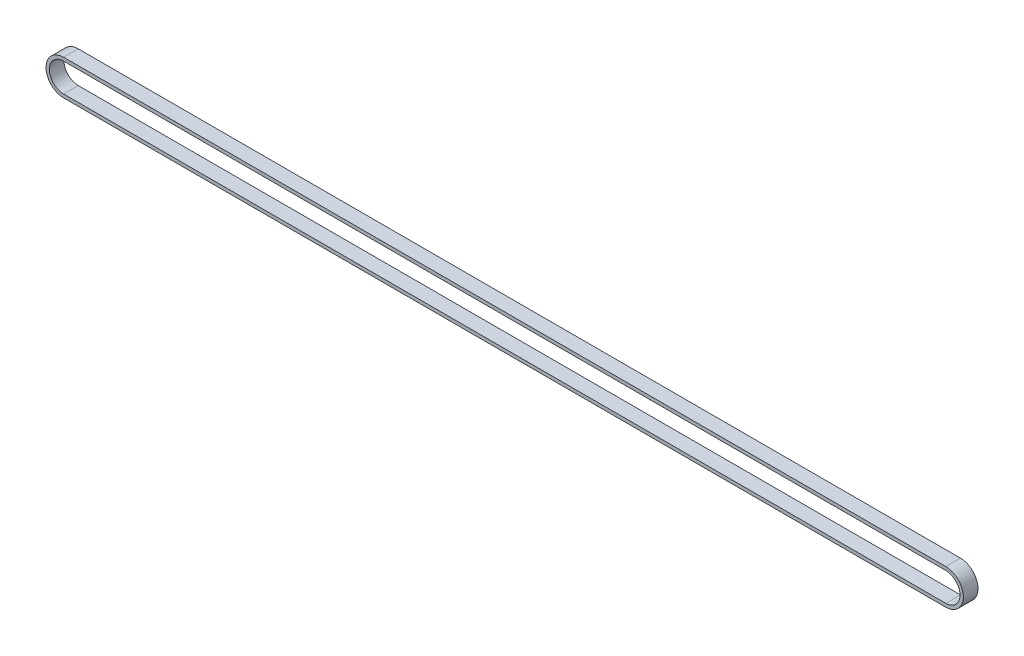
ISO-10303-21;
HEADER;
FILE_DESCRIPTION(('STEP AP214'),'2;1');
FILE_NAME('part.step','',(''),(''),'','','');
FILE_SCHEMA(('AUTOMOTIVE_DESIGN { 1 0 10303 214 1 1 1 1 }'));
ENDSEC;
DATA;
#1=APPLICATION_CONTEXT('core data for automotive mechanical design processes');
#2=APPLICATION_PROTOCOL_DEFINITION('international standard','automotive_design',2000,#1);
#3=PRODUCT_CONTEXT('',#1,'mechanical');
#4=PRODUCT('Part','Part','',(#3));
#5=PRODUCT_RELATED_PRODUCT_CATEGORY('part','',(#4));
#6=PRODUCT_DEFINITION_FORMATION('','',#4);
#7=PRODUCT_DEFINITION_CONTEXT('part definition',#1,'design');
#8=PRODUCT_DEFINITION('design','',#6,#7);
#9=PRODUCT_DEFINITION_SHAPE('','',#8);
#10=(LENGTH_UNIT() NAMED_UNIT(*) SI_UNIT(.MILLI.,.METRE.));
#11=(NAMED_UNIT(*) PLANE_ANGLE_UNIT() SI_UNIT($,.RADIAN.));
#12=(NAMED_UNIT(*) SI_UNIT($,.STERADIAN.) SOLID_ANGLE_UNIT());
#13=UNCERTAINTY_MEASURE_WITH_UNIT(LENGTH_MEASURE(1.E-05),#10,'distance_accuracy_value','');
#14=(GEOMETRIC_REPRESENTATION_CONTEXT(3) GLOBAL_UNCERTAINTY_ASSIGNED_CONTEXT((#13)) GLOBAL_UNIT_ASSIGNED_CONTEXT((#10,
#11,#12)) REPRESENTATION_CONTEXT('',''));
#15=CARTESIAN_POINT('',(0.,0.,0.));
#16=DIRECTION('',(0.,0.,1.));
#17=DIRECTION('',(1.,0.,0.));
#18=AXIS2_PLACEMENT_3D('',#15,#16,#17);
#19=CARTESIAN_POINT('',(0.,0.,6.));
#20=DIRECTION('',(0.,0.,1.));
#21=DIRECTION('',(1.,0.,0.));
#22=AXIS2_PLACEMENT_3D('',#19,#20,#21);
#23=PLANE('',#22);
#24=CARTESIAN_POINT('',(0.,0.,6.));
#25=DIRECTION('',(0.,0.,1.));
#26=DIRECTION('',(1.,0.,0.));
#27=AXIS2_PLACEMENT_3D('',#24,#25,#26);
#28=CIRCLE('',#27,7.213);
#29=CARTESIAN_POINT('',(0.,7.213,6.));
#30=VERTEX_POINT('',#29);
#31=CARTESIAN_POINT('',(0.,-7.213,6.));
#32=VERTEX_POINT('',#31);
#33=EDGE_CURVE('E134',#30,#32,#28,.T.);
#34=ORIENTED_EDGE('',*,*,#33,.T.);
#35=DIRECTION('',(1.,0.,0.));
#36=VECTOR('',#35,1.);
#37=CARTESIAN_POINT('',(0.,-7.213,6.));
#38=LINE('',#37,#36);
#39=CARTESIAN_POINT('',(361.5,-7.213,6.));
#40=VERTEX_POINT('',#39);
#41=EDGE_CURVE('E137',#32,#40,#38,.T.);
#42=ORIENTED_EDGE('',*,*,#41,.T.);
#43=CARTESIAN_POINT('',(361.5,0.,6.));
#44=DIRECTION('',(0.,0.,1.));
#45=DIRECTION('',(1.,0.,0.));
#46=AXIS2_PLACEMENT_3D('',#43,#44,#45);
#47=CIRCLE('',#46,7.213);
#48=CARTESIAN_POINT('',(361.5,7.213,6.));
#49=VERTEX_POINT('',#48);
#50=EDGE_CURVE('E140',#40,#49,#47,.T.);
#51=ORIENTED_EDGE('',*,*,#50,.T.);
#52=DIRECTION('',(-1.,0.,0.));
#53=VECTOR('',#52,1.);
#54=CARTESIAN_POINT('',(0.,7.213,6.));
#55=LINE('',#54,#53);
#56=EDGE_CURVE('E142',#49,#30,#55,.T.);
#57=ORIENTED_EDGE('',*,*,#56,.T.);
#58=EDGE_LOOP('',(#34,#42,#51,#57));
#59=FACE_BOUND('',#58,.T.);
#60=DIRECTION('',(1.,0.,0.));
#61=VECTOR('',#60,1.);
#62=CARTESIAN_POINT('',(361.5,-5.833,6.));
#63=LINE('',#62,#61);
#64=CARTESIAN_POINT('',(0.,-5.833,6.));
#65=VERTEX_POINT('',#64);
#66=CARTESIAN_POINT('',(361.5,-5.833,6.));
#67=VERTEX_POINT('',#66);
#68=EDGE_CURVE('E106',#65,#67,#63,.T.);
#69=ORIENTED_EDGE('',*,*,#68,.F.);
#70=CARTESIAN_POINT('',(0.,0.,6.));
#71=DIRECTION('',(0.,0.,1.));
#72=DIRECTION('',(1.,0.,0.));
#73=AXIS2_PLACEMENT_3D('',#70,#71,#72);
#74=CIRCLE('',#73,5.833);
#75=CARTESIAN_POINT('',(0.,5.833,6.));
#76=VERTEX_POINT('',#75);
#77=EDGE_CURVE('E98',#76,#65,#74,.T.);
#78=ORIENTED_EDGE('',*,*,#77,.F.);
#79=DIRECTION('',(-1.,0.,0.));
#80=VECTOR('',#79,1.);
#81=CARTESIAN_POINT('',(0.,5.833,6.));
#82=LINE('',#81,#80);
#83=CARTESIAN_POINT('',(361.5,5.833,6.));
#84=VERTEX_POINT('',#83);
#85=EDGE_CURVE('E120',#84,#76,#82,.T.);
#86=ORIENTED_EDGE('',*,*,#85,.F.);
#87=CARTESIAN_POINT('',(361.5,0.,6.));
#88=DIRECTION('',(0.,0.,1.));
#89=DIRECTION('',(1.,0.,0.));
#90=AXIS2_PLACEMENT_3D('',#87,#88,#89);
#91=CIRCLE('',#90,5.833);
#92=EDGE_CURVE('E118',#67,#84,#91,.T.);
#93=ORIENTED_EDGE('',*,*,#92,.F.);
#94=EDGE_LOOP('',(#69,#78,#86,#93));
#95=FACE_BOUND('',#94,.T.);
#96=ADVANCED_FACE('F33',(#59,#95),#23,.T.);
#97=CARTESIAN_POINT('',(0.,0.,0.));
#98=DIRECTION('',(0.,0.,1.));
#99=DIRECTION('',(1.,0.,0.));
#100=AXIS2_PLACEMENT_3D('',#97,#98,#99);
#101=PLANE('',#100);
#102=CARTESIAN_POINT('',(0.,0.,0.));
#103=DIRECTION('',(0.,0.,1.));
#104=DIRECTION('',(1.,0.,0.));
#105=AXIS2_PLACEMENT_3D('',#102,#103,#104);
#106=CIRCLE('',#105,7.213);
#107=CARTESIAN_POINT('',(0.,7.213,0.));
#108=VERTEX_POINT('',#107);
#109=CARTESIAN_POINT('',(0.,-7.213,0.));
#110=VERTEX_POINT('',#109);
#111=EDGE_CURVE('E114',#108,#110,#106,.T.);
#112=ORIENTED_EDGE('',*,*,#111,.F.);
#113=DIRECTION('',(-1.,0.,0.));
#114=VECTOR('',#113,1.);
#115=CARTESIAN_POINT('',(0.,7.213,0.));
#116=LINE('',#115,#114);
#117=CARTESIAN_POINT('',(361.5,7.213,0.));
#118=VERTEX_POINT('',#117);
#119=EDGE_CURVE('E138',#118,#108,#116,.T.);
#120=ORIENTED_EDGE('',*,*,#119,.F.);
#121=CARTESIAN_POINT('',(361.5,0.,0.));
#122=DIRECTION('',(0.,0.,1.));
#123=DIRECTION('',(1.,0.,0.));
#124=AXIS2_PLACEMENT_3D('',#121,#122,#123);
#125=CIRCLE('',#124,7.213);
#126=CARTESIAN_POINT('',(361.5,-7.213,0.));
#127=VERTEX_POINT('',#126);
#128=EDGE_CURVE('E149',#127,#118,#125,.T.);
#129=ORIENTED_EDGE('',*,*,#128,.F.);
#130=DIRECTION('',(1.,0.,0.));
#131=VECTOR('',#130,1.);
#132=CARTESIAN_POINT('',(0.,-7.213,0.));
#133=LINE('',#132,#131);
#134=EDGE_CURVE('E147',#110,#127,#133,.T.);
#135=ORIENTED_EDGE('',*,*,#134,.F.);
#136=EDGE_LOOP('',(#112,#120,#129,#135));
#137=FACE_BOUND('',#136,.T.);
#138=CARTESIAN_POINT('',(0.,0.,0.));
#139=DIRECTION('',(0.,0.,1.));
#140=DIRECTION('',(1.,0.,0.));
#141=AXIS2_PLACEMENT_3D('',#138,#139,#140);
#142=CIRCLE('',#141,5.833);
#143=CARTESIAN_POINT('',(0.,5.833,0.));
#144=VERTEX_POINT('',#143);
#145=CARTESIAN_POINT('',(0.,-5.833,0.));
#146=VERTEX_POINT('',#145);
#147=EDGE_CURVE('E56',#144,#146,#142,.T.);
#148=ORIENTED_EDGE('',*,*,#147,.T.);
#149=DIRECTION('',(1.,0.,0.));
#150=VECTOR('',#149,1.);
#151=CARTESIAN_POINT('',(361.5,-5.833,0.));
#152=LINE('',#151,#150);
#153=CARTESIAN_POINT('',(361.5,-5.833,0.));
#154=VERTEX_POINT('',#153);
#155=EDGE_CURVE('E113',#146,#154,#152,.T.);
#156=ORIENTED_EDGE('',*,*,#155,.T.);
#157=CARTESIAN_POINT('',(361.5,0.,0.));
#158=DIRECTION('',(0.,0.,1.));
#159=DIRECTION('',(1.,0.,0.));
#160=AXIS2_PLACEMENT_3D('',#157,#158,#159);
#161=CIRCLE('',#160,5.833);
#162=CARTESIAN_POINT('',(361.5,5.833,0.));
#163=VERTEX_POINT('',#162);
#164=EDGE_CURVE('E126',#154,#163,#161,.T.);
#165=ORIENTED_EDGE('',*,*,#164,.T.);
#166=DIRECTION('',(-1.,0.,0.));
#167=VECTOR('',#166,1.);
#168=CARTESIAN_POINT('',(0.,5.833,0.));
#169=LINE('',#168,#167);
#170=EDGE_CURVE('E107',#163,#144,#169,.T.);
#171=ORIENTED_EDGE('',*,*,#170,.T.);
#172=EDGE_LOOP('',(#148,#156,#165,#171));
#173=FACE_BOUND('',#172,.T.);
#174=ADVANCED_FACE('F167',(#137,#173),#101,.F.);
#175=CARTESIAN_POINT('',(0.,0.,6.));
#176=DIRECTION('',(0.,0.,-1.));
#177=DIRECTION('',(-1.,0.,0.));
#178=AXIS2_PLACEMENT_3D('',#175,#176,#177);
#179=CYLINDRICAL_SURFACE('',#178,7.213);
#180=ORIENTED_EDGE('',*,*,#111,.T.);
#181=DIRECTION('',(0.,0.,-1.));
#182=VECTOR('',#181,1.);
#183=CARTESIAN_POINT('',(0.,-7.213,6.));
#184=LINE('',#183,#182);
#185=EDGE_CURVE('E11',#32,#110,#184,.T.);
#186=ORIENTED_EDGE('',*,*,#185,.F.);
#187=ORIENTED_EDGE('',*,*,#33,.F.);
#188=DIRECTION('',(0.,0.,-1.));
#189=VECTOR('',#188,1.);
#190=CARTESIAN_POINT('',(0.,7.213,6.));
#191=LINE('',#190,#189);
#192=EDGE_CURVE('E144',#30,#108,#191,.T.);
#193=ORIENTED_EDGE('',*,*,#192,.T.);
#194=EDGE_LOOP('',(#180,#186,#187,#193));
#195=FACE_BOUND('',#194,.T.);
#196=ADVANCED_FACE('F35',(#195),#179,.T.);
#197=CARTESIAN_POINT('',(0.,-7.213,6.));
#198=DIRECTION('',(0.,1.,0.));
#199=DIRECTION('',(0.,0.,1.));
#200=AXIS2_PLACEMENT_3D('',#197,#198,#199);
#201=PLANE('',#200);
#202=ORIENTED_EDGE('',*,*,#134,.T.);
#203=DIRECTION('',(0.,0.,-1.));
#204=VECTOR('',#203,1.);
#205=CARTESIAN_POINT('',(361.5,-7.213,6.));
#206=LINE('',#205,#204);
#207=EDGE_CURVE('E41',#40,#127,#206,.T.);
#208=ORIENTED_EDGE('',*,*,#207,.F.);
#209=ORIENTED_EDGE('',*,*,#41,.F.);
#210=ORIENTED_EDGE('',*,*,#185,.T.);
#211=EDGE_LOOP('',(#202,#208,#209,#210));
#212=FACE_BOUND('',#211,.T.);
#213=ADVANCED_FACE('F177',(#212),#201,.F.);
#214=CARTESIAN_POINT('',(361.5,0.,6.));
#215=DIRECTION('',(0.,0.,-1.));
#216=DIRECTION('',(-1.,0.,0.));
#217=AXIS2_PLACEMENT_3D('',#214,#215,#216);
#218=CYLINDRICAL_SURFACE('',#217,7.213);
#219=ORIENTED_EDGE('',*,*,#128,.T.);
#220=DIRECTION('',(0.,0.,-1.));
#221=VECTOR('',#220,1.);
#222=CARTESIAN_POINT('',(361.5,7.213,6.));
#223=LINE('',#222,#221);
#224=EDGE_CURVE('E154',#49,#118,#223,.T.);
#225=ORIENTED_EDGE('',*,*,#224,.F.);
#226=ORIENTED_EDGE('',*,*,#50,.F.);
#227=ORIENTED_EDGE('',*,*,#207,.T.);
#228=EDGE_LOOP('',(#219,#225,#226,#227));
#229=FACE_BOUND('',#228,.T.);
#230=ADVANCED_FACE('F161',(#229),#218,.T.);
#231=CARTESIAN_POINT('',(0.,7.213,6.));
#232=DIRECTION('',(0.,-1.,0.));
#233=DIRECTION('',(0.,0.,-1.));
#234=AXIS2_PLACEMENT_3D('',#231,#232,#233);
#235=PLANE('',#234);
#236=ORIENTED_EDGE('',*,*,#119,.T.);
#237=ORIENTED_EDGE('',*,*,#192,.F.);
#238=ORIENTED_EDGE('',*,*,#56,.F.);
#239=ORIENTED_EDGE('',*,*,#224,.T.);
#240=EDGE_LOOP('',(#236,#237,#238,#239));
#241=FACE_BOUND('',#240,.T.);
#242=ADVANCED_FACE('F171',(#241),#235,.F.);
#243=CARTESIAN_POINT('',(0.,0.,6.));
#244=DIRECTION('',(0.,0.,-1.));
#245=DIRECTION('',(-1.,0.,0.));
#246=AXIS2_PLACEMENT_3D('',#243,#244,#245);
#247=CYLINDRICAL_SURFACE('',#246,5.833);
#248=ORIENTED_EDGE('',*,*,#147,.F.);
#249=DIRECTION('',(0.,0.,-1.));
#250=VECTOR('',#249,1.);
#251=CARTESIAN_POINT('',(0.,5.833,6.));
#252=LINE('',#251,#250);
#253=EDGE_CURVE('E102',#76,#144,#252,.T.);
#254=ORIENTED_EDGE('',*,*,#253,.F.);
#255=ORIENTED_EDGE('',*,*,#77,.T.);
#256=DIRECTION('',(0.,0.,-1.));
#257=VECTOR('',#256,1.);
#258=CARTESIAN_POINT('',(0.,-5.833,6.));
#259=LINE('',#258,#257);
#260=EDGE_CURVE('E101',#65,#146,#259,.T.);
#261=ORIENTED_EDGE('',*,*,#260,.T.);
#262=EDGE_LOOP('',(#248,#254,#255,#261));
#263=FACE_BOUND('',#262,.T.);
#264=ADVANCED_FACE('F100',(#263),#247,.F.);
#265=CARTESIAN_POINT('',(361.5,-5.833,6.));
#266=DIRECTION('',(0.,1.,0.));
#267=DIRECTION('',(0.,0.,1.));
#268=AXIS2_PLACEMENT_3D('',#265,#266,#267);
#269=PLANE('',#268);
#270=ORIENTED_EDGE('',*,*,#155,.F.);
#271=ORIENTED_EDGE('',*,*,#260,.F.);
#272=ORIENTED_EDGE('',*,*,#68,.T.);
#273=DIRECTION('',(0.,0.,-1.));
#274=VECTOR('',#273,1.);
#275=CARTESIAN_POINT('',(361.5,-5.833,6.));
#276=LINE('',#275,#274);
#277=EDGE_CURVE('E115',#67,#154,#276,.T.);
#278=ORIENTED_EDGE('',*,*,#277,.T.);
#279=EDGE_LOOP('',(#270,#271,#272,#278));
#280=FACE_BOUND('',#279,.T.);
#281=ADVANCED_FACE('F110',(#280),#269,.T.);
#282=CARTESIAN_POINT('',(361.5,0.,6.));
#283=DIRECTION('',(0.,0.,-1.));
#284=DIRECTION('',(-1.,0.,0.));
#285=AXIS2_PLACEMENT_3D('',#282,#283,#284);
#286=CYLINDRICAL_SURFACE('',#285,5.833);
#287=ORIENTED_EDGE('',*,*,#164,.F.);
#288=ORIENTED_EDGE('',*,*,#277,.F.);
#289=ORIENTED_EDGE('',*,*,#92,.T.);
#290=DIRECTION('',(0.,0.,-1.));
#291=VECTOR('',#290,1.);
#292=CARTESIAN_POINT('',(361.5,5.833,6.));
#293=LINE('',#292,#291);
#294=EDGE_CURVE('E48',#84,#163,#293,.T.);
#295=ORIENTED_EDGE('',*,*,#294,.T.);
#296=EDGE_LOOP('',(#287,#288,#289,#295));
#297=FACE_BOUND('',#296,.T.);
#298=ADVANCED_FACE('F200',(#297),#286,.F.);
#299=CARTESIAN_POINT('',(0.,5.833,6.));
#300=DIRECTION('',(0.,-1.,0.));
#301=DIRECTION('',(0.,0.,-1.));
#302=AXIS2_PLACEMENT_3D('',#299,#300,#301);
#303=PLANE('',#302);
#304=ORIENTED_EDGE('',*,*,#170,.F.);
#305=ORIENTED_EDGE('',*,*,#294,.F.);
#306=ORIENTED_EDGE('',*,*,#85,.T.);
#307=ORIENTED_EDGE('',*,*,#253,.T.);
#308=EDGE_LOOP('',(#304,#305,#306,#307));
#309=FACE_BOUND('',#308,.T.);
#310=ADVANCED_FACE('F204',(#309),#303,.T.);
#311=CLOSED_SHELL('',(#96,#174,#196,#213,#230,#242,#264,#281,#298,#310));
#312=MANIFOLD_SOLID_BREP('B2',#311);
#313=ADVANCED_BREP_SHAPE_REPRESENTATION('',(#18,#312),#14);
#314=SHAPE_DEFINITION_REPRESENTATION(#9,#313);
ENDSEC;
END-ISO-10303-21;
